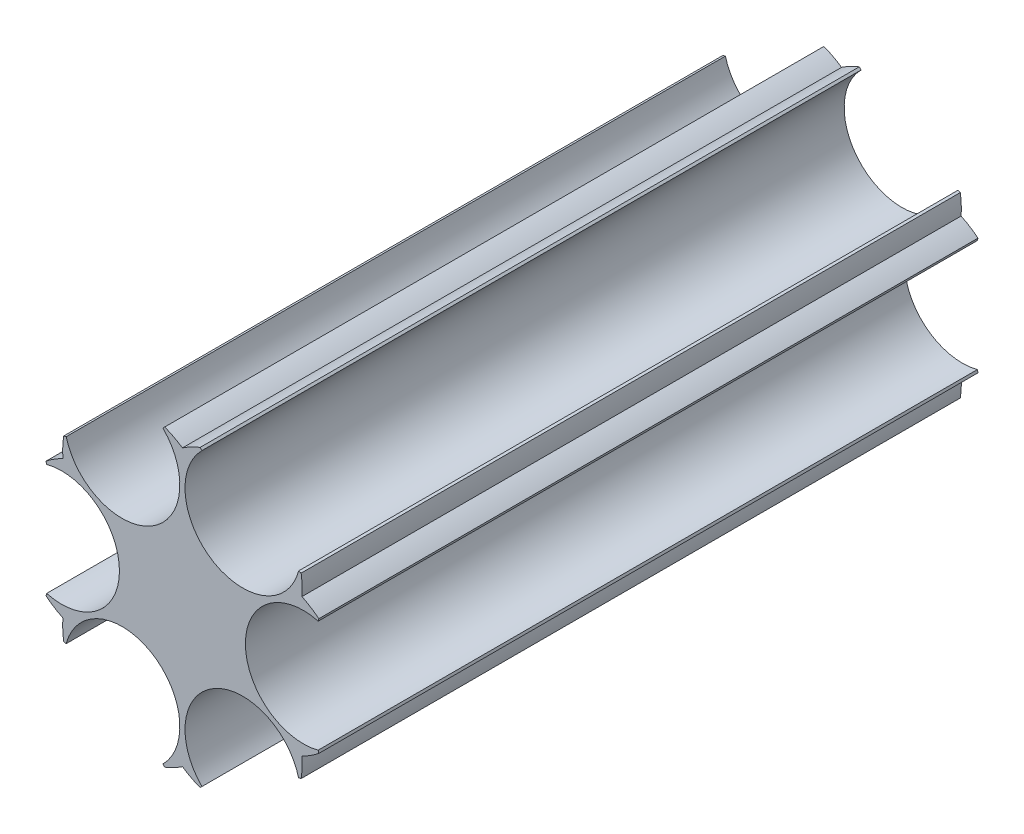
ISO-10303-21;
HEADER;
FILE_DESCRIPTION(('STEP AP214'),'2;1');
FILE_NAME('part.step','',(''),(''),'','','');
FILE_SCHEMA(('AUTOMOTIVE_DESIGN { 1 0 10303 214 1 1 1 1 }'));
ENDSEC;
DATA;
#1=APPLICATION_CONTEXT('core data for automotive mechanical design processes');
#2=APPLICATION_PROTOCOL_DEFINITION('international standard','automotive_design',2000,#1);
#3=PRODUCT_CONTEXT('',#1,'mechanical');
#4=PRODUCT('Part','Part','',(#3));
#5=PRODUCT_RELATED_PRODUCT_CATEGORY('part','',(#4));
#6=PRODUCT_DEFINITION_FORMATION('','',#4);
#7=PRODUCT_DEFINITION_CONTEXT('part definition',#1,'design');
#8=PRODUCT_DEFINITION('design','',#6,#7);
#9=PRODUCT_DEFINITION_SHAPE('','',#8);
#10=(LENGTH_UNIT() NAMED_UNIT(*) SI_UNIT(.MILLI.,.METRE.));
#11=(NAMED_UNIT(*) PLANE_ANGLE_UNIT() SI_UNIT($,.RADIAN.));
#12=(NAMED_UNIT(*) SI_UNIT($,.STERADIAN.) SOLID_ANGLE_UNIT());
#13=UNCERTAINTY_MEASURE_WITH_UNIT(LENGTH_MEASURE(1.E-05),#10,'distance_accuracy_value','');
#14=(GEOMETRIC_REPRESENTATION_CONTEXT(3) GLOBAL_UNCERTAINTY_ASSIGNED_CONTEXT((#13)) GLOBAL_UNIT_ASSIGNED_CONTEXT((#10,
#11,#12)) REPRESENTATION_CONTEXT('',''));
#15=CARTESIAN_POINT('',(0.,0.,0.));
#16=DIRECTION('',(0.,0.,1.));
#17=DIRECTION('',(1.,0.,0.));
#18=AXIS2_PLACEMENT_3D('',#15,#16,#17);
#19=CARTESIAN_POINT('',(-9.70750505134843,21.895959589533,191.));
#20=DIRECTION('',(0.,0.,-1.));
#21=DIRECTION('',(-1.,0.,0.));
#22=AXIS2_PLACEMENT_3D('',#19,#20,#21);
#23=CYLINDRICAL_SURFACE('',#22,25.);
#24=CARTESIAN_POINT('',(-9.70750505134843,21.895959589533,0.));
#25=DIRECTION('',(0.,0.,1.));
#26=DIRECTION('',(1.,0.,0.));
#27=AXIS2_PLACEMENT_3D('',#24,#25,#26);
#28=CIRCLE('',#27,25.);
#29=CARTESIAN_POINT('',(-34.4037019600587,25.7815558431612,0.));
#30=VERTEX_POINT('',#29);
#31=CARTESIAN_POINT('',(-34.6352549156242,19.996673748987,0.));
#32=VERTEX_POINT('',#31);
#33=EDGE_CURVE('E265',#30,#32,#28,.T.);
#34=ORIENTED_EDGE('',*,*,#33,.T.);
#35=DIRECTION('',(0.,0.,-1.));
#36=VECTOR('',#35,1.);
#37=CARTESIAN_POINT('',(-34.6352549156242,19.996673748987,191.));
#38=LINE('',#37,#36);
#39=CARTESIAN_POINT('',(-34.6352549156242,19.996673748987,191.));
#40=VERTEX_POINT('',#39);
#41=EDGE_CURVE('E11',#40,#32,#38,.T.);
#42=ORIENTED_EDGE('',*,*,#41,.F.);
#43=CARTESIAN_POINT('',(-9.70750505134843,21.895959589533,191.));
#44=DIRECTION('',(0.,0.,1.));
#45=DIRECTION('',(1.,0.,0.));
#46=AXIS2_PLACEMENT_3D('',#43,#44,#45);
#47=CIRCLE('',#46,25.);
#48=CARTESIAN_POINT('',(-34.4037019600587,25.7815558431612,191.));
#49=VERTEX_POINT('',#48);
#50=EDGE_CURVE('E323',#49,#40,#47,.T.);
#51=ORIENTED_EDGE('',*,*,#50,.F.);
#52=DIRECTION('',(0.,0.,-1.));
#53=VECTOR('',#52,1.);
#54=CARTESIAN_POINT('',(-34.4037019600587,25.7815558431612,191.));
#55=LINE('',#54,#53);
#56=EDGE_CURVE('E261',#49,#30,#55,.T.);
#57=ORIENTED_EDGE('',*,*,#56,.T.);
#58=EDGE_LOOP('',(#34,#42,#51,#57));
#59=FACE_BOUND('',#58,.T.);
#60=ADVANCED_FACE('F37',(#59),#23,.T.);
#61=CARTESIAN_POINT('',(-23.8162097704473,-2.541033812933,191.));
#62=DIRECTION('',(0.,0.,-1.));
#63=DIRECTION('',(-1.,0.,0.));
#64=AXIS2_PLACEMENT_3D('',#61,#62,#63);
#65=CYLINDRICAL_SURFACE('',#64,25.);
#66=CARTESIAN_POINT('',(-23.8162097704473,-2.541033812933,0.));
#67=DIRECTION('',(0.,0.,1.));
#68=DIRECTION('',(-1.,0.,0.));
#69=AXIS2_PLACEMENT_3D('',#66,#67,#68);
#70=CIRCLE('',#69,25.);
#71=CARTESIAN_POINT('',(-39.5293332892941,16.9037019600587,0.));
#72=VERTEX_POINT('',#71);
#73=EDGE_CURVE('E268',#32,#72,#70,.T.);
#74=ORIENTED_EDGE('',*,*,#73,.T.);
#75=DIRECTION('',(0.,0.,-1.));
#76=VECTOR('',#75,1.);
#77=CARTESIAN_POINT('',(-39.5293332892941,16.9037019600587,191.));
#78=LINE('',#77,#76);
#79=CARTESIAN_POINT('',(-39.5293332892941,16.9037019600587,191.));
#80=VERTEX_POINT('',#79);
#81=EDGE_CURVE('E45',#80,#72,#78,.T.);
#82=ORIENTED_EDGE('',*,*,#81,.F.);
#83=CARTESIAN_POINT('',(-23.8162097704473,-2.541033812933,191.));
#84=DIRECTION('',(0.,0.,1.));
#85=DIRECTION('',(-1.,0.,0.));
#86=AXIS2_PLACEMENT_3D('',#83,#84,#85);
#87=CIRCLE('',#86,25.);
#88=EDGE_CURVE('E162',#40,#80,#87,.T.);
#89=ORIENTED_EDGE('',*,*,#88,.F.);
#90=ORIENTED_EDGE('',*,*,#41,.T.);
#91=EDGE_LOOP('',(#74,#82,#89,#90));
#92=FACE_BOUND('',#91,.T.);
#93=ADVANCED_FACE('F491',(#92),#65,.T.);
#94=CARTESIAN_POINT('',(-39.5293332892941,16.9037019600587,191.));
#95=DIRECTION('',(0.96592582628906,0.258819045102553,0.));
#96=DIRECTION('',(-0.258819045102553,0.96592582628906,0.));
#97=AXIS2_PLACEMENT_3D('',#94,#95,#96);
#98=PLANE('',#97);
#99=DIRECTION('',(0.258819045102553,-0.96592582628906,0.));
#100=VECTOR('',#99,1.);
#101=CARTESIAN_POINT('',(-39.5293332892941,16.9037019600587,0.));
#102=LINE('',#101,#100);
#103=CARTESIAN_POINT('',(-39.3352190054672,16.1792575903419,0.));
#104=VERTEX_POINT('',#103);
#105=EDGE_CURVE('E270',#72,#104,#102,.T.);
#106=ORIENTED_EDGE('',*,*,#105,.T.);
#107=DIRECTION('',(0.,0.,-1.));
#108=VECTOR('',#107,1.);
#109=CARTESIAN_POINT('',(-39.3352190054672,16.1792575903419,191.));
#110=LINE('',#109,#108);
#111=CARTESIAN_POINT('',(-39.3352190054672,16.1792575903419,191.));
#112=VERTEX_POINT('',#111);
#113=EDGE_CURVE('E396',#112,#104,#110,.T.);
#114=ORIENTED_EDGE('',*,*,#113,.F.);
#115=DIRECTION('',(0.258819045102553,-0.96592582628906,0.));
#116=VECTOR('',#115,1.);
#117=CARTESIAN_POINT('',(-39.5293332892941,16.9037019600587,191.));
#118=LINE('',#117,#116);
#119=EDGE_CURVE('E404',#80,#112,#118,.T.);
#120=ORIENTED_EDGE('',*,*,#119,.F.);
#121=ORIENTED_EDGE('',*,*,#81,.T.);
#122=EDGE_LOOP('',(#106,#114,#120,#121));
#123=FACE_BOUND('',#122,.T.);
#124=ADVANCED_FACE('F402',(#123),#98,.F.);
#125=CARTESIAN_POINT('',(-35.,0.,191.));
#126=DIRECTION('',(0.,0.,-1.));
#127=DIRECTION('',(-1.,0.,0.));
#128=AXIS2_PLACEMENT_3D('',#125,#126,#127);
#129=CYLINDRICAL_SURFACE('',#128,16.75);
#130=CARTESIAN_POINT('',(-35.,0.,0.));
#131=DIRECTION('',(0.,0.,-1.));
#132=DIRECTION('',(-1.,0.,0.));
#133=AXIS2_PLACEMENT_3D('',#130,#131,#132);
#134=CIRCLE('',#133,16.75);
#135=CARTESIAN_POINT('',(-39.3352190054672,-16.1792575903419,0.));
#136=VERTEX_POINT('',#135);
#137=EDGE_CURVE('E272',#104,#136,#134,.T.);
#138=ORIENTED_EDGE('',*,*,#137,.T.);
#139=DIRECTION('',(0.,0.,-1.));
#140=VECTOR('',#139,1.);
#141=CARTESIAN_POINT('',(-39.3352190054672,-16.1792575903419,191.));
#142=LINE('',#141,#140);
#143=CARTESIAN_POINT('',(-39.3352190054672,-16.1792575903419,191.));
#144=VERTEX_POINT('',#143);
#145=EDGE_CURVE('E393',#144,#136,#142,.T.);
#146=ORIENTED_EDGE('',*,*,#145,.F.);
#147=CARTESIAN_POINT('',(-35.,0.,191.));
#148=DIRECTION('',(0.,0.,-1.));
#149=DIRECTION('',(-1.,0.,0.));
#150=AXIS2_PLACEMENT_3D('',#147,#148,#149);
#151=CIRCLE('',#150,16.75);
#152=EDGE_CURVE('E422',#112,#144,#151,.T.);
#153=ORIENTED_EDGE('',*,*,#152,.F.);
#154=ORIENTED_EDGE('',*,*,#113,.T.);
#155=EDGE_LOOP('',(#138,#146,#153,#154));
#156=FACE_BOUND('',#155,.T.);
#157=ADVANCED_FACE('F413',(#156),#129,.F.);
#158=CARTESIAN_POINT('',(-39.5293332892941,-16.9037019600587,191.));
#159=DIRECTION('',(0.965925826289078,-0.258819045102484,0.));
#160=DIRECTION('',(0.258819045102484,0.965925826289078,0.));
#161=AXIS2_PLACEMENT_3D('',#158,#159,#160);
#162=PLANE('',#161);
#163=DIRECTION('',(-0.258819045102484,-0.965925826289078,0.));
#164=VECTOR('',#163,1.);
#165=CARTESIAN_POINT('',(-39.5293332892941,-16.9037019600587,0.));
#166=LINE('',#165,#164);
#167=CARTESIAN_POINT('',(-39.5293332892941,-16.9037019600587,0.));
#168=VERTEX_POINT('',#167);
#169=EDGE_CURVE('E274',#136,#168,#166,.T.);
#170=ORIENTED_EDGE('',*,*,#169,.T.);
#171=DIRECTION('',(0.,0.,-1.));
#172=VECTOR('',#171,1.);
#173=CARTESIAN_POINT('',(-39.5293332892941,-16.9037019600587,191.));
#174=LINE('',#173,#172);
#175=CARTESIAN_POINT('',(-39.5293332892941,-16.9037019600587,191.));
#176=VERTEX_POINT('',#175);
#177=EDGE_CURVE('E390',#176,#168,#174,.T.);
#178=ORIENTED_EDGE('',*,*,#177,.F.);
#179=DIRECTION('',(-0.258819045102484,-0.965925826289078,0.));
#180=VECTOR('',#179,1.);
#181=CARTESIAN_POINT('',(-39.5293332892941,-16.9037019600587,191.));
#182=LINE('',#181,#180);
#183=EDGE_CURVE('E419',#144,#176,#182,.T.);
#184=ORIENTED_EDGE('',*,*,#183,.F.);
#185=ORIENTED_EDGE('',*,*,#145,.T.);
#186=EDGE_LOOP('',(#170,#178,#184,#185));
#187=FACE_BOUND('',#186,.T.);
#188=ADVANCED_FACE('F417',(#187),#162,.F.);
#189=CARTESIAN_POINT('',(-23.8162097704473,2.541033812933,191.));
#190=DIRECTION('',(0.,0.,-1.));
#191=DIRECTION('',(-1.,0.,0.));
#192=AXIS2_PLACEMENT_3D('',#189,#190,#191);
#193=CYLINDRICAL_SURFACE('',#192,25.);
#194=CARTESIAN_POINT('',(-23.8162097704473,2.541033812933,0.));
#195=DIRECTION('',(0.,0.,1.));
#196=DIRECTION('',(1.,0.,0.));
#197=AXIS2_PLACEMENT_3D('',#194,#195,#196);
#198=CIRCLE('',#197,25.);
#199=CARTESIAN_POINT('',(-34.6352549156242,-19.9966737489869,0.));
#200=VERTEX_POINT('',#199);
#201=EDGE_CURVE('E276',#168,#200,#198,.T.);
#202=ORIENTED_EDGE('',*,*,#201,.T.);
#203=DIRECTION('',(0.,0.,-1.));
#204=VECTOR('',#203,1.);
#205=CARTESIAN_POINT('',(-34.6352549156242,-19.9966737489869,191.));
#206=LINE('',#205,#204);
#207=CARTESIAN_POINT('',(-34.6352549156242,-19.9966737489869,191.));
#208=VERTEX_POINT('',#207);
#209=EDGE_CURVE('E387',#208,#200,#206,.T.);
#210=ORIENTED_EDGE('',*,*,#209,.F.);
#211=CARTESIAN_POINT('',(-23.8162097704473,2.541033812933,191.));
#212=DIRECTION('',(0.,0.,1.));
#213=DIRECTION('',(1.,0.,0.));
#214=AXIS2_PLACEMENT_3D('',#211,#212,#213);
#215=CIRCLE('',#214,25.);
#216=EDGE_CURVE('E421',#176,#208,#215,.T.);
#217=ORIENTED_EDGE('',*,*,#216,.F.);
#218=ORIENTED_EDGE('',*,*,#177,.T.);
#219=EDGE_LOOP('',(#202,#210,#217,#218));
#220=FACE_BOUND('',#219,.T.);
#221=ADVANCED_FACE('F504',(#220),#193,.T.);
#222=CARTESIAN_POINT('',(-9.70750505134841,-21.895959589533,191.));
#223=DIRECTION('',(0.,0.,-1.));
#224=DIRECTION('',(-1.,0.,0.));
#225=AXIS2_PLACEMENT_3D('',#222,#223,#224);
#226=CYLINDRICAL_SURFACE('',#225,25.);
#227=CARTESIAN_POINT('',(-9.70750505134841,-21.895959589533,0.));
#228=DIRECTION('',(0.,0.,1.));
#229=DIRECTION('',(-1.,0.,0.));
#230=AXIS2_PLACEMENT_3D('',#227,#228,#229);
#231=CIRCLE('',#230,25.);
#232=CARTESIAN_POINT('',(-34.4037019600587,-25.7815558431613,0.));
#233=VERTEX_POINT('',#232);
#234=EDGE_CURVE('E278',#200,#233,#231,.T.);
#235=ORIENTED_EDGE('',*,*,#234,.T.);
#236=DIRECTION('',(0.,0.,-1.));
#237=VECTOR('',#236,1.);
#238=CARTESIAN_POINT('',(-34.4037019600587,-25.7815558431613,191.));
#239=LINE('',#238,#237);
#240=CARTESIAN_POINT('',(-34.4037019600587,-25.7815558431613,191.));
#241=VERTEX_POINT('',#240);
#242=EDGE_CURVE('E384',#241,#233,#239,.T.);
#243=ORIENTED_EDGE('',*,*,#242,.F.);
#244=CARTESIAN_POINT('',(-9.70750505134841,-21.895959589533,191.));
#245=DIRECTION('',(0.,0.,1.));
#246=DIRECTION('',(-1.,0.,0.));
#247=AXIS2_PLACEMENT_3D('',#244,#245,#246);
#248=CIRCLE('',#247,25.);
#249=EDGE_CURVE('E424',#208,#241,#248,.T.);
#250=ORIENTED_EDGE('',*,*,#249,.F.);
#251=ORIENTED_EDGE('',*,*,#209,.T.);
#252=EDGE_LOOP('',(#235,#243,#250,#251));
#253=FACE_BOUND('',#252,.T.);
#254=ADVANCED_FACE('F507',(#253),#226,.T.);
#255=CARTESIAN_POINT('',(-34.4037019600587,-25.7815558431613,191.));
#256=DIRECTION('',(0.258819045102499,0.965925826289074,0.));
#257=DIRECTION('',(-0.965925826289074,0.258819045102499,0.));
#258=AXIS2_PLACEMENT_3D('',#255,#256,#257);
#259=PLANE('',#258);
#260=DIRECTION('',(0.965925826289074,-0.258819045102499,0.));
#261=VECTOR('',#260,1.);
#262=CARTESIAN_POINT('',(-34.4037019600587,-25.7815558431613,0.));
#263=LINE('',#262,#261);
#264=CARTESIAN_POINT('',(-33.6792575903419,-25.9756701269881,0.));
#265=VERTEX_POINT('',#264);
#266=EDGE_CURVE('E280',#233,#265,#263,.T.);
#267=ORIENTED_EDGE('',*,*,#266,.T.);
#268=DIRECTION('',(0.,0.,-1.));
#269=VECTOR('',#268,1.);
#270=CARTESIAN_POINT('',(-33.6792575903419,-25.9756701269881,191.));
#271=LINE('',#270,#269);
#272=CARTESIAN_POINT('',(-33.6792575903419,-25.9756701269881,191.));
#273=VERTEX_POINT('',#272);
#274=EDGE_CURVE('E381',#273,#265,#271,.T.);
#275=ORIENTED_EDGE('',*,*,#274,.F.);
#276=DIRECTION('',(0.965925826289074,-0.258819045102499,0.));
#277=VECTOR('',#276,1.);
#278=CARTESIAN_POINT('',(-34.4037019600587,-25.7815558431613,191.));
#279=LINE('',#278,#277);
#280=EDGE_CURVE('E430',#241,#273,#279,.T.);
#281=ORIENTED_EDGE('',*,*,#280,.F.);
#282=ORIENTED_EDGE('',*,*,#242,.T.);
#283=EDGE_LOOP('',(#267,#275,#281,#282));
#284=FACE_BOUND('',#283,.T.);
#285=ADVANCED_FACE('F511',(#284),#259,.F.);
#286=CARTESIAN_POINT('',(-17.5,-30.3108891324554,191.));
#287=DIRECTION('',(0.,0.,-1.));
#288=DIRECTION('',(-1.,0.,0.));
#289=AXIS2_PLACEMENT_3D('',#286,#287,#288);
#290=CYLINDRICAL_SURFACE('',#289,16.75);
#291=CARTESIAN_POINT('',(-17.5,-30.3108891324554,0.));
#292=DIRECTION('',(0.,0.,-1.));
#293=DIRECTION('',(-1.,0.,0.));
#294=AXIS2_PLACEMENT_3D('',#291,#292,#293);
#295=CIRCLE('',#294,16.75);
#296=CARTESIAN_POINT('',(-5.6559614151253,-42.15492771733,0.));
#297=VERTEX_POINT('',#296);
#298=EDGE_CURVE('E282',#265,#297,#295,.T.);
#299=ORIENTED_EDGE('',*,*,#298,.T.);
#300=DIRECTION('',(0.,0.,-1.));
#301=VECTOR('',#300,1.);
#302=CARTESIAN_POINT('',(-5.6559614151253,-42.15492771733,191.));
#303=LINE('',#302,#301);
#304=CARTESIAN_POINT('',(-5.6559614151253,-42.15492771733,191.));
#305=VERTEX_POINT('',#304);
#306=EDGE_CURVE('E378',#305,#297,#303,.T.);
#307=ORIENTED_EDGE('',*,*,#306,.F.);
#308=CARTESIAN_POINT('',(-17.5,-30.3108891324554,191.));
#309=DIRECTION('',(0.,0.,-1.));
#310=DIRECTION('',(-1.,0.,0.));
#311=AXIS2_PLACEMENT_3D('',#308,#309,#310);
#312=CIRCLE('',#311,16.75);
#313=EDGE_CURVE('E432',#273,#305,#312,.T.);
#314=ORIENTED_EDGE('',*,*,#313,.F.);
#315=ORIENTED_EDGE('',*,*,#274,.T.);
#316=EDGE_LOOP('',(#299,#307,#314,#315));
#317=FACE_BOUND('',#316,.T.);
#318=ADVANCED_FACE('F515',(#317),#290,.F.);
#319=CARTESIAN_POINT('',(-5.12563132923538,-42.6852578032199,191.));
#320=DIRECTION('',(0.70710678118652,0.707106781186575,0.));
#321=DIRECTION('',(-0.707106781186575,0.70710678118652,0.));
#322=AXIS2_PLACEMENT_3D('',#319,#320,#321);
#323=PLANE('',#322);
#324=DIRECTION('',(0.707106781186575,-0.70710678118652,0.));
#325=VECTOR('',#324,1.);
#326=CARTESIAN_POINT('',(-5.12563132923538,-42.6852578032199,0.));
#327=LINE('',#326,#325);
#328=CARTESIAN_POINT('',(-5.12563132923538,-42.6852578032199,0.));
#329=VERTEX_POINT('',#328);
#330=EDGE_CURVE('E284',#297,#329,#327,.T.);
#331=ORIENTED_EDGE('',*,*,#330,.T.);
#332=DIRECTION('',(0.,0.,-1.));
#333=VECTOR('',#332,1.);
#334=CARTESIAN_POINT('',(-5.12563132923538,-42.6852578032199,191.));
#335=LINE('',#334,#333);
#336=CARTESIAN_POINT('',(-5.12563132923538,-42.6852578032199,191.));
#337=VERTEX_POINT('',#336);
#338=EDGE_CURVE('E375',#337,#329,#335,.T.);
#339=ORIENTED_EDGE('',*,*,#338,.F.);
#340=DIRECTION('',(0.707106781186575,-0.70710678118652,0.));
#341=VECTOR('',#340,1.);
#342=CARTESIAN_POINT('',(-5.12563132923538,-42.6852578032199,191.));
#343=LINE('',#342,#341);
#344=EDGE_CURVE('E434',#305,#337,#343,.T.);
#345=ORIENTED_EDGE('',*,*,#344,.F.);
#346=ORIENTED_EDGE('',*,*,#306,.T.);
#347=EDGE_LOOP('',(#331,#339,#345,#346));
#348=FACE_BOUND('',#347,.T.);
#349=ADVANCED_FACE('F519',(#348),#323,.F.);
#350=CARTESIAN_POINT('',(-14.1087047190988,-19.3549257766,191.));
#351=DIRECTION('',(0.,0.,-1.));
#352=DIRECTION('',(-1.,0.,0.));
#353=AXIS2_PLACEMENT_3D('',#350,#351,#352);
#354=CYLINDRICAL_SURFACE('',#353,25.);
#355=CARTESIAN_POINT('',(-14.1087047190988,-19.3549257766,0.));
#356=DIRECTION('',(0.,0.,1.));
#357=DIRECTION('',(1.,0.,0.));
#358=AXIS2_PLACEMENT_3D('',#355,#356,#357);
#359=CIRCLE('',#358,25.);
#360=CARTESIAN_POINT('',(0.,-39.9933474979739,0.));
#361=VERTEX_POINT('',#360);
#362=EDGE_CURVE('E286',#329,#361,#359,.T.);
#363=ORIENTED_EDGE('',*,*,#362,.T.);
#364=DIRECTION('',(0.,0.,-1.));
#365=VECTOR('',#364,1.);
#366=CARTESIAN_POINT('',(0.,-39.9933474979739,191.));
#367=LINE('',#366,#365);
#368=CARTESIAN_POINT('',(0.,-39.9933474979739,191.));
#369=VERTEX_POINT('',#368);
#370=EDGE_CURVE('E372',#369,#361,#367,.T.);
#371=ORIENTED_EDGE('',*,*,#370,.F.);
#372=CARTESIAN_POINT('',(-14.1087047190988,-19.3549257766,191.));
#373=DIRECTION('',(0.,0.,1.));
#374=DIRECTION('',(1.,0.,0.));
#375=AXIS2_PLACEMENT_3D('',#372,#373,#374);
#376=CIRCLE('',#375,25.);
#377=EDGE_CURVE('E436',#337,#369,#376,.T.);
#378=ORIENTED_EDGE('',*,*,#377,.F.);
#379=ORIENTED_EDGE('',*,*,#338,.T.);
#380=EDGE_LOOP('',(#363,#371,#378,#379));
#381=FACE_BOUND('',#380,.T.);
#382=ADVANCED_FACE('F523',(#381),#354,.T.);
#383=CARTESIAN_POINT('',(14.1087047190989,-19.3549257766,191.));
#384=DIRECTION('',(0.,0.,-1.));
#385=DIRECTION('',(-1.,0.,0.));
#386=AXIS2_PLACEMENT_3D('',#383,#384,#385);
#387=CYLINDRICAL_SURFACE('',#386,25.);
#388=CARTESIAN_POINT('',(14.1087047190989,-19.3549257766,0.));
#389=DIRECTION('',(0.,0.,1.));
#390=DIRECTION('',(-1.,0.,0.));
#391=AXIS2_PLACEMENT_3D('',#388,#389,#390);
#392=CIRCLE('',#391,25.);
#393=CARTESIAN_POINT('',(5.12563132923546,-42.6852578032199,0.));
#394=VERTEX_POINT('',#393);
#395=EDGE_CURVE('E288',#361,#394,#392,.T.);
#396=ORIENTED_EDGE('',*,*,#395,.T.);
#397=DIRECTION('',(0.,0.,-1.));
#398=VECTOR('',#397,1.);
#399=CARTESIAN_POINT('',(5.12563132923546,-42.6852578032199,191.));
#400=LINE('',#399,#398);
#401=CARTESIAN_POINT('',(5.12563132923546,-42.6852578032199,191.));
#402=VERTEX_POINT('',#401);
#403=EDGE_CURVE('E369',#402,#394,#400,.T.);
#404=ORIENTED_EDGE('',*,*,#403,.F.);
#405=CARTESIAN_POINT('',(14.1087047190989,-19.3549257766,191.));
#406=DIRECTION('',(0.,0.,1.));
#407=DIRECTION('',(-1.,0.,0.));
#408=AXIS2_PLACEMENT_3D('',#405,#406,#407);
#409=CIRCLE('',#408,25.);
#410=EDGE_CURVE('E438',#369,#402,#409,.T.);
#411=ORIENTED_EDGE('',*,*,#410,.F.);
#412=ORIENTED_EDGE('',*,*,#370,.T.);
#413=EDGE_LOOP('',(#396,#404,#411,#412));
#414=FACE_BOUND('',#413,.T.);
#415=ADVANCED_FACE('F527',(#414),#387,.T.);
#416=CARTESIAN_POINT('',(5.12563132923545,-42.6852578032199,191.));
#417=DIRECTION('',(-0.707106781186567,0.707106781186528,0.));
#418=DIRECTION('',(-0.707106781186528,-0.707106781186567,0.));
#419=AXIS2_PLACEMENT_3D('',#416,#417,#418);
#420=PLANE('',#419);
#421=DIRECTION('',(0.707106781186528,0.707106781186567,0.));
#422=VECTOR('',#421,1.);
#423=CARTESIAN_POINT('',(5.12563132923545,-42.6852578032199,0.));
#424=LINE('',#423,#422);
#425=CARTESIAN_POINT('',(5.65596141512534,-42.15492771733,0.));
#426=VERTEX_POINT('',#425);
#427=EDGE_CURVE('E290',#394,#426,#424,.T.);
#428=ORIENTED_EDGE('',*,*,#427,.T.);
#429=DIRECTION('',(0.,0.,-1.));
#430=VECTOR('',#429,1.);
#431=CARTESIAN_POINT('',(5.65596141512534,-42.15492771733,191.));
#432=LINE('',#431,#430);
#433=CARTESIAN_POINT('',(5.65596141512534,-42.15492771733,191.));
#434=VERTEX_POINT('',#433);
#435=EDGE_CURVE('E366',#434,#426,#432,.T.);
#436=ORIENTED_EDGE('',*,*,#435,.F.);
#437=DIRECTION('',(0.707106781186528,0.707106781186567,0.));
#438=VECTOR('',#437,1.);
#439=CARTESIAN_POINT('',(5.12563132923545,-42.6852578032199,191.));
#440=LINE('',#439,#438);
#441=EDGE_CURVE('E440',#402,#434,#440,.T.);
#442=ORIENTED_EDGE('',*,*,#441,.F.);
#443=ORIENTED_EDGE('',*,*,#403,.T.);
#444=EDGE_LOOP('',(#428,#436,#442,#443));
#445=FACE_BOUND('',#444,.T.);
#446=ADVANCED_FACE('F531',(#445),#420,.F.);
#447=CARTESIAN_POINT('',(17.5,-30.3108891324554,191.));
#448=DIRECTION('',(0.,0.,-1.));
#449=DIRECTION('',(-1.,0.,0.));
#450=AXIS2_PLACEMENT_3D('',#447,#448,#449);
#451=CYLINDRICAL_SURFACE('',#450,16.75);
#452=CARTESIAN_POINT('',(17.5,-30.3108891324554,0.));
#453=DIRECTION('',(0.,0.,-1.));
#454=DIRECTION('',(-1.,0.,0.));
#455=AXIS2_PLACEMENT_3D('',#452,#453,#454);
#456=CIRCLE('',#455,16.75);
#457=CARTESIAN_POINT('',(33.6792575903419,-25.9756701269881,0.));
#458=VERTEX_POINT('',#457);
#459=EDGE_CURVE('E292',#426,#458,#456,.T.);
#460=ORIENTED_EDGE('',*,*,#459,.T.);
#461=DIRECTION('',(0.,0.,-1.));
#462=VECTOR('',#461,1.);
#463=CARTESIAN_POINT('',(33.6792575903419,-25.9756701269881,191.));
#464=LINE('',#463,#462);
#465=CARTESIAN_POINT('',(33.6792575903419,-25.9756701269881,191.));
#466=VERTEX_POINT('',#465);
#467=EDGE_CURVE('E363',#466,#458,#464,.T.);
#468=ORIENTED_EDGE('',*,*,#467,.F.);
#469=CARTESIAN_POINT('',(17.5,-30.3108891324554,191.));
#470=DIRECTION('',(0.,0.,-1.));
#471=DIRECTION('',(-1.,0.,0.));
#472=AXIS2_PLACEMENT_3D('',#469,#470,#471);
#473=CIRCLE('',#472,16.75);
#474=EDGE_CURVE('E442',#434,#466,#473,.T.);
#475=ORIENTED_EDGE('',*,*,#474,.F.);
#476=ORIENTED_EDGE('',*,*,#435,.T.);
#477=EDGE_LOOP('',(#460,#468,#475,#476));
#478=FACE_BOUND('',#477,.T.);
#479=ADVANCED_FACE('F535',(#478),#451,.F.);
#480=CARTESIAN_POINT('',(34.4037019600587,-25.7815558431612,191.));
#481=DIRECTION('',(-0.258819045102554,0.965925826289059,0.));
#482=DIRECTION('',(-0.96592582628906,-0.258819045102554,0.));
#483=AXIS2_PLACEMENT_3D('',#480,#481,#482);
#484=PLANE('',#483);
#485=DIRECTION('',(0.965925826289059,0.258819045102554,0.));
#486=VECTOR('',#485,1.);
#487=CARTESIAN_POINT('',(34.4037019600587,-25.7815558431612,0.));
#488=LINE('',#487,#486);
#489=CARTESIAN_POINT('',(34.4037019600587,-25.7815558431612,0.));
#490=VERTEX_POINT('',#489);
#491=EDGE_CURVE('E294',#458,#490,#488,.T.);
#492=ORIENTED_EDGE('',*,*,#491,.T.);
#493=DIRECTION('',(0.,0.,-1.));
#494=VECTOR('',#493,1.);
#495=CARTESIAN_POINT('',(34.4037019600587,-25.7815558431612,191.));
#496=LINE('',#495,#494);
#497=CARTESIAN_POINT('',(34.4037019600587,-25.7815558431612,191.));
#498=VERTEX_POINT('',#497);
#499=EDGE_CURVE('E360',#498,#490,#496,.T.);
#500=ORIENTED_EDGE('',*,*,#499,.F.);
#501=DIRECTION('',(0.965925826289059,0.258819045102554,0.));
#502=VECTOR('',#501,1.);
#503=CARTESIAN_POINT('',(34.4037019600587,-25.7815558431612,191.));
#504=LINE('',#503,#502);
#505=EDGE_CURVE('E444',#466,#498,#504,.T.);
#506=ORIENTED_EDGE('',*,*,#505,.F.);
#507=ORIENTED_EDGE('',*,*,#467,.T.);
#508=EDGE_LOOP('',(#492,#500,#506,#507));
#509=FACE_BOUND('',#508,.T.);
#510=ADVANCED_FACE('F539',(#509),#484,.F.);
#511=CARTESIAN_POINT('',(9.70750505134844,-21.895959589533,191.));
#512=DIRECTION('',(0.,0.,-1.));
#513=DIRECTION('',(-1.,0.,0.));
#514=AXIS2_PLACEMENT_3D('',#511,#512,#513);
#515=CYLINDRICAL_SURFACE('',#514,25.);
#516=CARTESIAN_POINT('',(9.70750505134844,-21.895959589533,0.));
#517=DIRECTION('',(0.,0.,1.));
#518=DIRECTION('',(1.,0.,0.));
#519=AXIS2_PLACEMENT_3D('',#516,#517,#518);
#520=CIRCLE('',#519,25.);
#521=CARTESIAN_POINT('',(34.6352549156242,-19.9966737489869,0.));
#522=VERTEX_POINT('',#521);
#523=EDGE_CURVE('E296',#490,#522,#520,.T.);
#524=ORIENTED_EDGE('',*,*,#523,.T.);
#525=DIRECTION('',(0.,0.,-1.));
#526=VECTOR('',#525,1.);
#527=CARTESIAN_POINT('',(34.6352549156242,-19.9966737489869,191.));
#528=LINE('',#527,#526);
#529=CARTESIAN_POINT('',(34.6352549156242,-19.9966737489869,191.));
#530=VERTEX_POINT('',#529);
#531=EDGE_CURVE('E357',#530,#522,#528,.T.);
#532=ORIENTED_EDGE('',*,*,#531,.F.);
#533=CARTESIAN_POINT('',(9.70750505134844,-21.895959589533,191.));
#534=DIRECTION('',(0.,0.,1.));
#535=DIRECTION('',(1.,0.,0.));
#536=AXIS2_PLACEMENT_3D('',#533,#534,#535);
#537=CIRCLE('',#536,25.);
#538=EDGE_CURVE('E446',#498,#530,#537,.T.);
#539=ORIENTED_EDGE('',*,*,#538,.F.);
#540=ORIENTED_EDGE('',*,*,#499,.T.);
#541=EDGE_LOOP('',(#524,#532,#539,#540));
#542=FACE_BOUND('',#541,.T.);
#543=ADVANCED_FACE('F543',(#542),#515,.T.);
#544=CARTESIAN_POINT('',(23.8162097704473,2.54103381293301,191.));
#545=DIRECTION('',(0.,0.,-1.));
#546=DIRECTION('',(-1.,0.,0.));
#547=AXIS2_PLACEMENT_3D('',#544,#545,#546);
#548=CYLINDRICAL_SURFACE('',#547,25.);
#549=CARTESIAN_POINT('',(23.8162097704473,2.54103381293301,0.));
#550=DIRECTION('',(0.,0.,1.));
#551=DIRECTION('',(-1.,0.,0.));
#552=AXIS2_PLACEMENT_3D('',#549,#550,#551);
#553=CIRCLE('',#552,25.);
#554=CARTESIAN_POINT('',(39.5293332892941,-16.9037019600587,0.));
#555=VERTEX_POINT('',#554);
#556=EDGE_CURVE('E298',#522,#555,#553,.T.);
#557=ORIENTED_EDGE('',*,*,#556,.T.);
#558=DIRECTION('',(0.,0.,-1.));
#559=VECTOR('',#558,1.);
#560=CARTESIAN_POINT('',(39.5293332892941,-16.9037019600587,191.));
#561=LINE('',#560,#559);
#562=CARTESIAN_POINT('',(39.5293332892941,-16.9037019600587,191.));
#563=VERTEX_POINT('',#562);
#564=EDGE_CURVE('E354',#563,#555,#561,.T.);
#565=ORIENTED_EDGE('',*,*,#564,.F.);
#566=CARTESIAN_POINT('',(23.8162097704473,2.54103381293301,191.));
#567=DIRECTION('',(0.,0.,1.));
#568=DIRECTION('',(-1.,0.,0.));
#569=AXIS2_PLACEMENT_3D('',#566,#567,#568);
#570=CIRCLE('',#569,25.);
#571=EDGE_CURVE('E448',#530,#563,#570,.T.);
#572=ORIENTED_EDGE('',*,*,#571,.F.);
#573=ORIENTED_EDGE('',*,*,#531,.T.);
#574=EDGE_LOOP('',(#557,#565,#572,#573));
#575=FACE_BOUND('',#574,.T.);
#576=ADVANCED_FACE('F547',(#575),#548,.T.);
#577=CARTESIAN_POINT('',(39.5293332892941,-16.9037019600587,191.));
#578=DIRECTION('',(-0.96592582628906,-0.258819045102553,0.));
#579=DIRECTION('',(0.258819045102553,-0.96592582628906,0.));
#580=AXIS2_PLACEMENT_3D('',#577,#578,#579);
#581=PLANE('',#580);
#582=DIRECTION('',(-0.258819045102553,0.96592582628906,0.));
#583=VECTOR('',#582,1.);
#584=CARTESIAN_POINT('',(39.5293332892941,-16.9037019600587,0.));
#585=LINE('',#584,#583);
#586=CARTESIAN_POINT('',(39.3352190054672,-16.1792575903419,0.));
#587=VERTEX_POINT('',#586);
#588=EDGE_CURVE('E300',#555,#587,#585,.T.);
#589=ORIENTED_EDGE('',*,*,#588,.T.);
#590=DIRECTION('',(0.,0.,-1.));
#591=VECTOR('',#590,1.);
#592=CARTESIAN_POINT('',(39.3352190054672,-16.1792575903419,191.));
#593=LINE('',#592,#591);
#594=CARTESIAN_POINT('',(39.3352190054672,-16.1792575903419,191.));
#595=VERTEX_POINT('',#594);
#596=EDGE_CURVE('E351',#595,#587,#593,.T.);
#597=ORIENTED_EDGE('',*,*,#596,.F.);
#598=DIRECTION('',(-0.258819045102553,0.96592582628906,0.));
#599=VECTOR('',#598,1.);
#600=CARTESIAN_POINT('',(39.5293332892941,-16.9037019600587,191.));
#601=LINE('',#600,#599);
#602=EDGE_CURVE('E450',#563,#595,#601,.T.);
#603=ORIENTED_EDGE('',*,*,#602,.F.);
#604=ORIENTED_EDGE('',*,*,#564,.T.);
#605=EDGE_LOOP('',(#589,#597,#603,#604));
#606=FACE_BOUND('',#605,.T.);
#607=ADVANCED_FACE('F551',(#606),#581,.F.);
#608=CARTESIAN_POINT('',(35.,0.,191.));
#609=DIRECTION('',(0.,0.,-1.));
#610=DIRECTION('',(-1.,0.,0.));
#611=AXIS2_PLACEMENT_3D('',#608,#609,#610);
#612=CYLINDRICAL_SURFACE('',#611,16.75);
#613=CARTESIAN_POINT('',(35.,0.,0.));
#614=DIRECTION('',(0.,0.,-1.));
#615=DIRECTION('',(-1.,0.,0.));
#616=AXIS2_PLACEMENT_3D('',#613,#614,#615);
#617=CIRCLE('',#616,16.75);
#618=CARTESIAN_POINT('',(39.3352190054673,16.1792575903419,0.));
#619=VERTEX_POINT('',#618);
#620=EDGE_CURVE('E302',#587,#619,#617,.T.);
#621=ORIENTED_EDGE('',*,*,#620,.T.);
#622=DIRECTION('',(0.,0.,-1.));
#623=VECTOR('',#622,1.);
#624=CARTESIAN_POINT('',(39.3352190054673,16.1792575903419,191.));
#625=LINE('',#624,#623);
#626=CARTESIAN_POINT('',(39.3352190054673,16.1792575903419,191.));
#627=VERTEX_POINT('',#626);
#628=EDGE_CURVE('E348',#627,#619,#625,.T.);
#629=ORIENTED_EDGE('',*,*,#628,.F.);
#630=CARTESIAN_POINT('',(35.,0.,191.));
#631=DIRECTION('',(0.,0.,-1.));
#632=DIRECTION('',(-1.,0.,0.));
#633=AXIS2_PLACEMENT_3D('',#630,#631,#632);
#634=CIRCLE('',#633,16.75);
#635=EDGE_CURVE('E452',#595,#627,#634,.T.);
#636=ORIENTED_EDGE('',*,*,#635,.F.);
#637=ORIENTED_EDGE('',*,*,#596,.T.);
#638=EDGE_LOOP('',(#621,#629,#636,#637));
#639=FACE_BOUND('',#638,.T.);
#640=ADVANCED_FACE('F555',(#639),#612,.F.);
#641=CARTESIAN_POINT('',(39.5293332892941,16.9037019600587,191.));
#642=DIRECTION('',(-0.965925826289078,0.258819045102484,0.));
#643=DIRECTION('',(-0.258819045102484,-0.965925826289078,0.));
#644=AXIS2_PLACEMENT_3D('',#641,#642,#643);
#645=PLANE('',#644);
#646=DIRECTION('',(0.258819045102484,0.965925826289078,0.));
#647=VECTOR('',#646,1.);
#648=CARTESIAN_POINT('',(39.5293332892941,16.9037019600587,0.));
#649=LINE('',#648,#647);
#650=CARTESIAN_POINT('',(39.5293332892941,16.9037019600587,0.));
#651=VERTEX_POINT('',#650);
#652=EDGE_CURVE('E304',#619,#651,#649,.T.);
#653=ORIENTED_EDGE('',*,*,#652,.T.);
#654=DIRECTION('',(0.,0.,-1.));
#655=VECTOR('',#654,1.);
#656=CARTESIAN_POINT('',(39.5293332892941,16.9037019600587,191.));
#657=LINE('',#656,#655);
#658=CARTESIAN_POINT('',(39.5293332892941,16.9037019600587,191.));
#659=VERTEX_POINT('',#658);
#660=EDGE_CURVE('E345',#659,#651,#657,.T.);
#661=ORIENTED_EDGE('',*,*,#660,.F.);
#662=DIRECTION('',(0.258819045102484,0.965925826289078,0.));
#663=VECTOR('',#662,1.);
#664=CARTESIAN_POINT('',(39.5293332892941,16.9037019600587,191.));
#665=LINE('',#664,#663);
#666=EDGE_CURVE('E454',#627,#659,#665,.T.);
#667=ORIENTED_EDGE('',*,*,#666,.F.);
#668=ORIENTED_EDGE('',*,*,#628,.T.);
#669=EDGE_LOOP('',(#653,#661,#667,#668));
#670=FACE_BOUND('',#669,.T.);
#671=ADVANCED_FACE('F559',(#670),#645,.F.);
#672=CARTESIAN_POINT('',(23.8162097704473,-2.541033812933,191.));
#673=DIRECTION('',(0.,0.,-1.));
#674=DIRECTION('',(-1.,0.,0.));
#675=AXIS2_PLACEMENT_3D('',#672,#673,#674);
#676=CYLINDRICAL_SURFACE('',#675,25.);
#677=CARTESIAN_POINT('',(23.8162097704473,-2.541033812933,0.));
#678=DIRECTION('',(0.,0.,1.));
#679=DIRECTION('',(1.,0.,0.));
#680=AXIS2_PLACEMENT_3D('',#677,#678,#679);
#681=CIRCLE('',#680,25.);
#682=CARTESIAN_POINT('',(34.6352549156242,19.996673748987,0.));
#683=VERTEX_POINT('',#682);
#684=EDGE_CURVE('E306',#651,#683,#681,.T.);
#685=ORIENTED_EDGE('',*,*,#684,.T.);
#686=DIRECTION('',(0.,0.,-1.));
#687=VECTOR('',#686,1.);
#688=CARTESIAN_POINT('',(34.6352549156242,19.996673748987,191.));
#689=LINE('',#688,#687);
#690=CARTESIAN_POINT('',(34.6352549156242,19.996673748987,191.));
#691=VERTEX_POINT('',#690);
#692=EDGE_CURVE('E342',#691,#683,#689,.T.);
#693=ORIENTED_EDGE('',*,*,#692,.F.);
#694=CARTESIAN_POINT('',(23.8162097704473,-2.541033812933,191.));
#695=DIRECTION('',(0.,0.,1.));
#696=DIRECTION('',(1.,0.,0.));
#697=AXIS2_PLACEMENT_3D('',#694,#695,#696);
#698=CIRCLE('',#697,25.);
#699=EDGE_CURVE('E456',#659,#691,#698,.T.);
#700=ORIENTED_EDGE('',*,*,#699,.F.);
#701=ORIENTED_EDGE('',*,*,#660,.T.);
#702=EDGE_LOOP('',(#685,#693,#700,#701));
#703=FACE_BOUND('',#702,.T.);
#704=ADVANCED_FACE('F563',(#703),#676,.T.);
#705=CARTESIAN_POINT('',(9.70750505134842,21.895959589533,191.));
#706=DIRECTION('',(0.,0.,-1.));
#707=DIRECTION('',(-1.,0.,0.));
#708=AXIS2_PLACEMENT_3D('',#705,#706,#707);
#709=CYLINDRICAL_SURFACE('',#708,25.);
#710=CARTESIAN_POINT('',(9.70750505134842,21.895959589533,0.));
#711=DIRECTION('',(0.,0.,1.));
#712=DIRECTION('',(-1.,0.,0.));
#713=AXIS2_PLACEMENT_3D('',#710,#711,#712);
#714=CIRCLE('',#713,25.);
#715=CARTESIAN_POINT('',(34.4037019600587,25.7815558431613,0.));
#716=VERTEX_POINT('',#715);
#717=EDGE_CURVE('E308',#683,#716,#714,.T.);
#718=ORIENTED_EDGE('',*,*,#717,.T.);
#719=DIRECTION('',(0.,0.,-1.));
#720=VECTOR('',#719,1.);
#721=CARTESIAN_POINT('',(34.4037019600587,25.7815558431613,191.));
#722=LINE('',#721,#720);
#723=CARTESIAN_POINT('',(34.4037019600587,25.7815558431613,191.));
#724=VERTEX_POINT('',#723);
#725=EDGE_CURVE('E339',#724,#716,#722,.T.);
#726=ORIENTED_EDGE('',*,*,#725,.F.);
#727=CARTESIAN_POINT('',(9.70750505134842,21.895959589533,191.));
#728=DIRECTION('',(0.,0.,1.));
#729=DIRECTION('',(-1.,0.,0.));
#730=AXIS2_PLACEMENT_3D('',#727,#728,#729);
#731=CIRCLE('',#730,25.);
#732=EDGE_CURVE('E458',#691,#724,#731,.T.);
#733=ORIENTED_EDGE('',*,*,#732,.F.);
#734=ORIENTED_EDGE('',*,*,#692,.T.);
#735=EDGE_LOOP('',(#718,#726,#733,#734));
#736=FACE_BOUND('',#735,.T.);
#737=ADVANCED_FACE('F567',(#736),#709,.T.);
#738=CARTESIAN_POINT('',(34.4037019600587,25.7815558431613,191.));
#739=DIRECTION('',(-0.258819045102497,-0.965925826289075,0.));
#740=DIRECTION('',(0.965925826289075,-0.258819045102497,0.));
#741=AXIS2_PLACEMENT_3D('',#738,#739,#740);
#742=PLANE('',#741);
#743=DIRECTION('',(-0.965925826289075,0.258819045102497,0.));
#744=VECTOR('',#743,1.);
#745=CARTESIAN_POINT('',(34.4037019600587,25.7815558431613,0.));
#746=LINE('',#745,#744);
#747=CARTESIAN_POINT('',(33.6792575903419,25.9756701269881,0.));
#748=VERTEX_POINT('',#747);
#749=EDGE_CURVE('E310',#716,#748,#746,.T.);
#750=ORIENTED_EDGE('',*,*,#749,.T.);
#751=DIRECTION('',(0.,0.,-1.));
#752=VECTOR('',#751,1.);
#753=CARTESIAN_POINT('',(33.6792575903419,25.9756701269881,191.));
#754=LINE('',#753,#752);
#755=CARTESIAN_POINT('',(33.6792575903419,25.9756701269881,191.));
#756=VERTEX_POINT('',#755);
#757=EDGE_CURVE('E336',#756,#748,#754,.T.);
#758=ORIENTED_EDGE('',*,*,#757,.F.);
#759=DIRECTION('',(-0.965925826289075,0.258819045102497,0.));
#760=VECTOR('',#759,1.);
#761=CARTESIAN_POINT('',(34.4037019600587,25.7815558431613,191.));
#762=LINE('',#761,#760);
#763=EDGE_CURVE('E460',#724,#756,#762,.T.);
#764=ORIENTED_EDGE('',*,*,#763,.F.);
#765=ORIENTED_EDGE('',*,*,#725,.T.);
#766=EDGE_LOOP('',(#750,#758,#764,#765));
#767=FACE_BOUND('',#766,.T.);
#768=ADVANCED_FACE('F571',(#767),#742,.F.);
#769=CARTESIAN_POINT('',(17.5,30.3108891324554,191.));
#770=DIRECTION('',(0.,0.,-1.));
#771=DIRECTION('',(-1.,0.,0.));
#772=AXIS2_PLACEMENT_3D('',#769,#770,#771);
#773=CYLINDRICAL_SURFACE('',#772,16.75);
#774=CARTESIAN_POINT('',(17.5,30.3108891324554,0.));
#775=DIRECTION('',(0.,0.,-1.));
#776=DIRECTION('',(-1.,0.,0.));
#777=AXIS2_PLACEMENT_3D('',#774,#775,#776);
#778=CIRCLE('',#777,16.75);
#779=CARTESIAN_POINT('',(5.65596141512533,42.1549277173301,0.));
#780=VERTEX_POINT('',#779);
#781=EDGE_CURVE('E312',#748,#780,#778,.T.);
#782=ORIENTED_EDGE('',*,*,#781,.T.);
#783=DIRECTION('',(0.,0.,-1.));
#784=VECTOR('',#783,1.);
#785=CARTESIAN_POINT('',(5.65596141512533,42.1549277173301,191.));
#786=LINE('',#785,#784);
#787=CARTESIAN_POINT('',(5.65596141512533,42.1549277173301,191.));
#788=VERTEX_POINT('',#787);
#789=EDGE_CURVE('E333',#788,#780,#786,.T.);
#790=ORIENTED_EDGE('',*,*,#789,.F.);
#791=CARTESIAN_POINT('',(17.5,30.3108891324554,191.));
#792=DIRECTION('',(0.,0.,-1.));
#793=DIRECTION('',(-1.,0.,0.));
#794=AXIS2_PLACEMENT_3D('',#791,#792,#793);
#795=CIRCLE('',#794,16.75);
#796=EDGE_CURVE('E462',#756,#788,#795,.T.);
#797=ORIENTED_EDGE('',*,*,#796,.F.);
#798=ORIENTED_EDGE('',*,*,#757,.T.);
#799=EDGE_LOOP('',(#782,#790,#797,#798));
#800=FACE_BOUND('',#799,.T.);
#801=ADVANCED_FACE('F575',(#800),#773,.F.);
#802=CARTESIAN_POINT('',(5.1256313292354,42.6852578032199,191.));
#803=DIRECTION('',(-0.70710678118652,-0.707106781186575,0.));
#804=DIRECTION('',(0.707106781186575,-0.70710678118652,0.));
#805=AXIS2_PLACEMENT_3D('',#802,#803,#804);
#806=PLANE('',#805);
#807=DIRECTION('',(-0.707106781186575,0.70710678118652,0.));
#808=VECTOR('',#807,1.);
#809=CARTESIAN_POINT('',(5.1256313292354,42.6852578032199,0.));
#810=LINE('',#809,#808);
#811=CARTESIAN_POINT('',(5.1256313292354,42.6852578032199,0.));
#812=VERTEX_POINT('',#811);
#813=EDGE_CURVE('E314',#780,#812,#810,.T.);
#814=ORIENTED_EDGE('',*,*,#813,.T.);
#815=DIRECTION('',(0.,0.,-1.));
#816=VECTOR('',#815,1.);
#817=CARTESIAN_POINT('',(5.1256313292354,42.6852578032199,191.));
#818=LINE('',#817,#816);
#819=CARTESIAN_POINT('',(5.1256313292354,42.6852578032199,191.));
#820=VERTEX_POINT('',#819);
#821=EDGE_CURVE('E330',#820,#812,#818,.T.);
#822=ORIENTED_EDGE('',*,*,#821,.F.);
#823=DIRECTION('',(-0.707106781186575,0.70710678118652,0.));
#824=VECTOR('',#823,1.);
#825=CARTESIAN_POINT('',(5.1256313292354,42.6852578032199,191.));
#826=LINE('',#825,#824);
#827=EDGE_CURVE('E464',#788,#820,#826,.T.);
#828=ORIENTED_EDGE('',*,*,#827,.F.);
#829=ORIENTED_EDGE('',*,*,#789,.T.);
#830=EDGE_LOOP('',(#814,#822,#828,#829));
#831=FACE_BOUND('',#830,.T.);
#832=ADVANCED_FACE('F579',(#831),#806,.F.);
#833=CARTESIAN_POINT('',(14.1087047190989,19.3549257766,191.));
#834=DIRECTION('',(0.,0.,-1.));
#835=DIRECTION('',(-1.,0.,0.));
#836=AXIS2_PLACEMENT_3D('',#833,#834,#835);
#837=CYLINDRICAL_SURFACE('',#836,25.);
#838=CARTESIAN_POINT('',(14.1087047190989,19.3549257766,0.));
#839=DIRECTION('',(0.,0.,1.));
#840=DIRECTION('',(1.,0.,0.));
#841=AXIS2_PLACEMENT_3D('',#838,#839,#840);
#842=CIRCLE('',#841,25.);
#843=CARTESIAN_POINT('',(0.,39.9933474979739,0.));
#844=VERTEX_POINT('',#843);
#845=EDGE_CURVE('E316',#812,#844,#842,.T.);
#846=ORIENTED_EDGE('',*,*,#845,.T.);
#847=DIRECTION('',(0.,0.,-1.));
#848=VECTOR('',#847,1.);
#849=CARTESIAN_POINT('',(0.,39.9933474979739,191.));
#850=LINE('',#849,#848);
#851=CARTESIAN_POINT('',(0.,39.9933474979739,191.));
#852=VERTEX_POINT('',#851);
#853=EDGE_CURVE('E327',#852,#844,#850,.T.);
#854=ORIENTED_EDGE('',*,*,#853,.F.);
#855=CARTESIAN_POINT('',(14.1087047190989,19.3549257766,191.));
#856=DIRECTION('',(0.,0.,1.));
#857=DIRECTION('',(1.,0.,0.));
#858=AXIS2_PLACEMENT_3D('',#855,#856,#857);
#859=CIRCLE('',#858,25.);
#860=EDGE_CURVE('E466',#820,#852,#859,.T.);
#861=ORIENTED_EDGE('',*,*,#860,.F.);
#862=ORIENTED_EDGE('',*,*,#821,.T.);
#863=EDGE_LOOP('',(#846,#854,#861,#862));
#864=FACE_BOUND('',#863,.T.);
#865=ADVANCED_FACE('F472',(#864),#837,.T.);
#866=CARTESIAN_POINT('',(-14.1087047190989,19.3549257766,191.));
#867=DIRECTION('',(0.,0.,-1.));
#868=DIRECTION('',(-1.,0.,0.));
#869=AXIS2_PLACEMENT_3D('',#866,#867,#868);
#870=CYLINDRICAL_SURFACE('',#869,25.);
#871=CARTESIAN_POINT('',(-14.1087047190989,19.3549257766,0.));
#872=DIRECTION('',(0.,0.,1.));
#873=DIRECTION('',(-1.,0.,0.));
#874=AXIS2_PLACEMENT_3D('',#871,#872,#873);
#875=CIRCLE('',#874,25.);
#876=CARTESIAN_POINT('',(-5.12563132923543,42.6852578032199,0.));
#877=VERTEX_POINT('',#876);
#878=EDGE_CURVE('E318',#844,#877,#875,.T.);
#879=ORIENTED_EDGE('',*,*,#878,.T.);
#880=DIRECTION('',(0.,0.,-1.));
#881=VECTOR('',#880,1.);
#882=CARTESIAN_POINT('',(-5.12563132923543,42.6852578032199,191.));
#883=LINE('',#882,#881);
#884=CARTESIAN_POINT('',(-5.12563132923543,42.6852578032199,191.));
#885=VERTEX_POINT('',#884);
#886=EDGE_CURVE('E256',#885,#877,#883,.T.);
#887=ORIENTED_EDGE('',*,*,#886,.F.);
#888=CARTESIAN_POINT('',(-14.1087047190989,19.3549257766,191.));
#889=DIRECTION('',(0.,0.,1.));
#890=DIRECTION('',(-1.,0.,0.));
#891=AXIS2_PLACEMENT_3D('',#888,#889,#890);
#892=CIRCLE('',#891,25.);
#893=EDGE_CURVE('E247',#852,#885,#892,.T.);
#894=ORIENTED_EDGE('',*,*,#893,.F.);
#895=ORIENTED_EDGE('',*,*,#853,.T.);
#896=EDGE_LOOP('',(#879,#887,#894,#895));
#897=FACE_BOUND('',#896,.T.);
#898=ADVANCED_FACE('F476',(#897),#870,.T.);
#899=CARTESIAN_POINT('',(-5.12563132923543,42.68525780322,191.));
#900=DIRECTION('',(0.707106781186576,-0.707106781186518,0.));
#901=DIRECTION('',(0.707106781186519,0.707106781186576,0.));
#902=AXIS2_PLACEMENT_3D('',#899,#900,#901);
#903=PLANE('',#902);
#904=DIRECTION('',(-0.707106781186519,-0.707106781186576,0.));
#905=VECTOR('',#904,1.);
#906=CARTESIAN_POINT('',(-5.12563132923543,42.68525780322,0.));
#907=LINE('',#906,#905);
#908=CARTESIAN_POINT('',(-5.65596141512532,42.15492771733,0.));
#909=VERTEX_POINT('',#908);
#910=EDGE_CURVE('E255',#877,#909,#907,.T.);
#911=ORIENTED_EDGE('',*,*,#910,.T.);
#912=DIRECTION('',(0.,0.,-1.));
#913=VECTOR('',#912,1.);
#914=CARTESIAN_POINT('',(-5.65596141512532,42.15492771733,191.));
#915=LINE('',#914,#913);
#916=CARTESIAN_POINT('',(-5.65596141512532,42.15492771733,191.));
#917=VERTEX_POINT('',#916);
#918=EDGE_CURVE('E252',#917,#909,#915,.T.);
#919=ORIENTED_EDGE('',*,*,#918,.F.);
#920=DIRECTION('',(-0.707106781186519,-0.707106781186576,0.));
#921=VECTOR('',#920,1.);
#922=CARTESIAN_POINT('',(-5.12563132923543,42.68525780322,191.));
#923=LINE('',#922,#921);
#924=EDGE_CURVE('E241',#885,#917,#923,.T.);
#925=ORIENTED_EDGE('',*,*,#924,.F.);
#926=ORIENTED_EDGE('',*,*,#886,.T.);
#927=EDGE_LOOP('',(#911,#919,#925,#926));
#928=FACE_BOUND('',#927,.T.);
#929=ADVANCED_FACE('F253',(#928),#903,.F.);
#930=CARTESIAN_POINT('',(-17.5,30.3108891324554,191.));
#931=DIRECTION('',(0.,0.,-1.));
#932=DIRECTION('',(-1.,0.,0.));
#933=AXIS2_PLACEMENT_3D('',#930,#931,#932);
#934=CYLINDRICAL_SURFACE('',#933,16.75);
#935=CARTESIAN_POINT('',(-17.5,30.3108891324554,0.));
#936=DIRECTION('',(0.,0.,-1.));
#937=DIRECTION('',(-1.,0.,0.));
#938=AXIS2_PLACEMENT_3D('',#935,#936,#937);
#939=CIRCLE('',#938,16.75);
#940=CARTESIAN_POINT('',(-33.6792575903419,25.9756701269881,0.));
#941=VERTEX_POINT('',#940);
#942=EDGE_CURVE('E148',#909,#941,#939,.T.);
#943=ORIENTED_EDGE('',*,*,#942,.T.);
#944=DIRECTION('',(0.,0.,-1.));
#945=VECTOR('',#944,1.);
#946=CARTESIAN_POINT('',(-33.6792575903419,25.9756701269881,191.));
#947=LINE('',#946,#945);
#948=CARTESIAN_POINT('',(-33.6792575903419,25.9756701269881,191.));
#949=VERTEX_POINT('',#948);
#950=EDGE_CURVE('E257',#949,#941,#947,.T.);
#951=ORIENTED_EDGE('',*,*,#950,.F.);
#952=CARTESIAN_POINT('',(-17.5,30.3108891324554,191.));
#953=DIRECTION('',(0.,0.,-1.));
#954=DIRECTION('',(-1.,0.,0.));
#955=AXIS2_PLACEMENT_3D('',#952,#953,#954);
#956=CIRCLE('',#955,16.75);
#957=EDGE_CURVE('E245',#917,#949,#956,.T.);
#958=ORIENTED_EDGE('',*,*,#957,.F.);
#959=ORIENTED_EDGE('',*,*,#918,.T.);
#960=EDGE_LOOP('',(#943,#951,#958,#959));
#961=FACE_BOUND('',#960,.T.);
#962=ADVANCED_FACE('F259',(#961),#934,.F.);
#963=CARTESIAN_POINT('',(-34.4037019600587,25.7815558431612,191.));
#964=DIRECTION('',(0.258819045102556,-0.965925826289059,0.));
#965=DIRECTION('',(0.965925826289059,0.258819045102556,0.));
#966=AXIS2_PLACEMENT_3D('',#963,#964,#965);
#967=PLANE('',#966);
#968=DIRECTION('',(-0.965925826289059,-0.258819045102556,0.));
#969=VECTOR('',#968,1.);
#970=CARTESIAN_POINT('',(-34.4037019600587,25.7815558431612,0.));
#971=LINE('',#970,#969);
#972=EDGE_CURVE('E154',#941,#30,#971,.T.);
#973=ORIENTED_EDGE('',*,*,#972,.T.);
#974=ORIENTED_EDGE('',*,*,#56,.F.);
#975=DIRECTION('',(-0.965925826289059,-0.258819045102556,0.));
#976=VECTOR('',#975,1.);
#977=CARTESIAN_POINT('',(-34.4037019600587,25.7815558431612,191.));
#978=LINE('',#977,#976);
#979=EDGE_CURVE('E53',#949,#49,#978,.T.);
#980=ORIENTED_EDGE('',*,*,#979,.F.);
#981=ORIENTED_EDGE('',*,*,#950,.T.);
#982=EDGE_LOOP('',(#973,#974,#980,#981));
#983=FACE_BOUND('',#982,.T.);
#984=ADVANCED_FACE('F480',(#983),#967,.F.);
#985=CARTESIAN_POINT('',(-9.70750505134843,21.895959589533,191.));
#986=DIRECTION('',(0.,0.,1.));
#987=DIRECTION('',(1.,0.,0.));
#988=AXIS2_PLACEMENT_3D('',#985,#986,#987);
#989=PLANE('',#988);
#990=ORIENTED_EDGE('',*,*,#50,.T.);
#991=ORIENTED_EDGE('',*,*,#88,.T.);
#992=ORIENTED_EDGE('',*,*,#119,.T.);
#993=ORIENTED_EDGE('',*,*,#152,.T.);
#994=ORIENTED_EDGE('',*,*,#183,.T.);
#995=ORIENTED_EDGE('',*,*,#216,.T.);
#996=ORIENTED_EDGE('',*,*,#249,.T.);
#997=ORIENTED_EDGE('',*,*,#280,.T.);
#998=ORIENTED_EDGE('',*,*,#313,.T.);
#999=ORIENTED_EDGE('',*,*,#344,.T.);
#1000=ORIENTED_EDGE('',*,*,#377,.T.);
#1001=ORIENTED_EDGE('',*,*,#410,.T.);
#1002=ORIENTED_EDGE('',*,*,#441,.T.);
#1003=ORIENTED_EDGE('',*,*,#474,.T.);
#1004=ORIENTED_EDGE('',*,*,#505,.T.);
#1005=ORIENTED_EDGE('',*,*,#538,.T.);
#1006=ORIENTED_EDGE('',*,*,#571,.T.);
#1007=ORIENTED_EDGE('',*,*,#602,.T.);
#1008=ORIENTED_EDGE('',*,*,#635,.T.);
#1009=ORIENTED_EDGE('',*,*,#666,.T.);
#1010=ORIENTED_EDGE('',*,*,#699,.T.);
#1011=ORIENTED_EDGE('',*,*,#732,.T.);
#1012=ORIENTED_EDGE('',*,*,#763,.T.);
#1013=ORIENTED_EDGE('',*,*,#796,.T.);
#1014=ORIENTED_EDGE('',*,*,#827,.T.);
#1015=ORIENTED_EDGE('',*,*,#860,.T.);
#1016=ORIENTED_EDGE('',*,*,#893,.T.);
#1017=ORIENTED_EDGE('',*,*,#924,.T.);
#1018=ORIENTED_EDGE('',*,*,#957,.T.);
#1019=ORIENTED_EDGE('',*,*,#979,.T.);
#1020=EDGE_LOOP('',(#990,#991,#992,#993,#994,#995,#996,#997,#998,#999,#1000,#1001,#1002,#1003,
#1004,#1005,#1006,#1007,#1008,#1009,#1010,#1011,#1012,#1013,#1014,#1015,#1016,#1017,#1018,#1019));
#1021=FACE_BOUND('',#1020,.T.);
#1022=ADVANCED_FACE('F243',(#1021),#989,.T.);
#1023=CARTESIAN_POINT('',(-9.70750505134843,21.895959589533,0.));
#1024=DIRECTION('',(0.,0.,1.));
#1025=DIRECTION('',(1.,0.,0.));
#1026=AXIS2_PLACEMENT_3D('',#1023,#1024,#1025);
#1027=PLANE('',#1026);
#1028=ORIENTED_EDGE('',*,*,#33,.F.);
#1029=ORIENTED_EDGE('',*,*,#972,.F.);
#1030=ORIENTED_EDGE('',*,*,#942,.F.);
#1031=ORIENTED_EDGE('',*,*,#910,.F.);
#1032=ORIENTED_EDGE('',*,*,#878,.F.);
#1033=ORIENTED_EDGE('',*,*,#845,.F.);
#1034=ORIENTED_EDGE('',*,*,#813,.F.);
#1035=ORIENTED_EDGE('',*,*,#781,.F.);
#1036=ORIENTED_EDGE('',*,*,#749,.F.);
#1037=ORIENTED_EDGE('',*,*,#717,.F.);
#1038=ORIENTED_EDGE('',*,*,#684,.F.);
#1039=ORIENTED_EDGE('',*,*,#652,.F.);
#1040=ORIENTED_EDGE('',*,*,#620,.F.);
#1041=ORIENTED_EDGE('',*,*,#588,.F.);
#1042=ORIENTED_EDGE('',*,*,#556,.F.);
#1043=ORIENTED_EDGE('',*,*,#523,.F.);
#1044=ORIENTED_EDGE('',*,*,#491,.F.);
#1045=ORIENTED_EDGE('',*,*,#459,.F.);
#1046=ORIENTED_EDGE('',*,*,#427,.F.);
#1047=ORIENTED_EDGE('',*,*,#395,.F.);
#1048=ORIENTED_EDGE('',*,*,#362,.F.);
#1049=ORIENTED_EDGE('',*,*,#330,.F.);
#1050=ORIENTED_EDGE('',*,*,#298,.F.);
#1051=ORIENTED_EDGE('',*,*,#266,.F.);
#1052=ORIENTED_EDGE('',*,*,#234,.F.);
#1053=ORIENTED_EDGE('',*,*,#201,.F.);
#1054=ORIENTED_EDGE('',*,*,#169,.F.);
#1055=ORIENTED_EDGE('',*,*,#137,.F.);
#1056=ORIENTED_EDGE('',*,*,#105,.F.);
#1057=ORIENTED_EDGE('',*,*,#73,.F.);
#1058=EDGE_LOOP('',(#1028,#1029,#1030,#1031,#1032,#1033,#1034,#1035,#1036,#1037,#1038,#1039,
#1040,#1041,#1042,#1043,#1044,#1045,#1046,#1047,#1048,#1049,#1050,#1051,#1052,#1053,#1054,#1055,
#1056,#1057));
#1059=FACE_BOUND('',#1058,.T.);
#1060=ADVANCED_FACE('F408',(#1059),#1027,.F.);
#1061=CLOSED_SHELL('',(#60,#93,#124,#157,#188,#221,#254,#285,#318,#349,#382,#415,#446,#479,#510,
#543,#576,#607,#640,#671,#704,#737,#768,#801,#832,#865,#898,#929,#962,#984,#1022,#1060));
#1062=MANIFOLD_SOLID_BREP('B2',#1061);
#1063=ADVANCED_BREP_SHAPE_REPRESENTATION('',(#18,#1062),#14);
#1064=SHAPE_DEFINITION_REPRESENTATION(#9,#1063);
ENDSEC;
END-ISO-10303-21;
